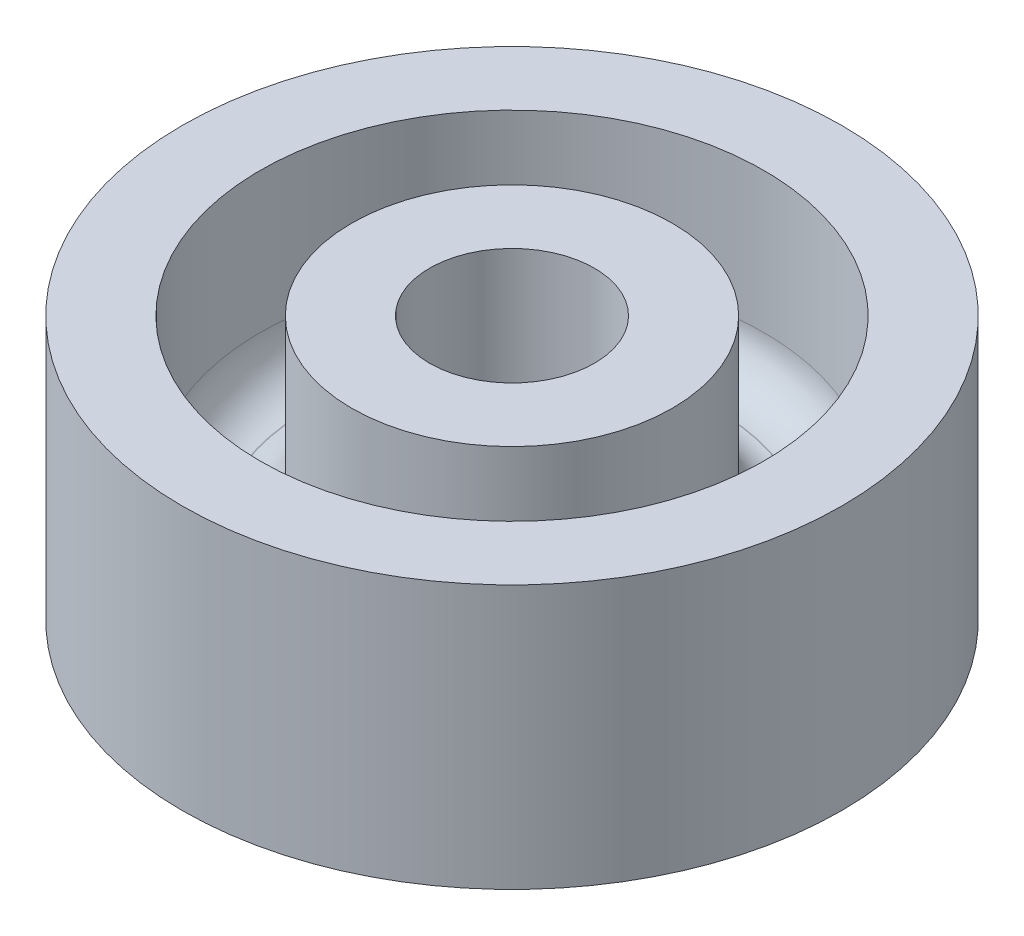
ISO-10303-21;
HEADER;
FILE_DESCRIPTION(('STEP AP214'),'2;1');
FILE_NAME('part.step','',(''),(''),'','','');
FILE_SCHEMA(('AUTOMOTIVE_DESIGN { 1 0 10303 214 1 1 1 1 }'));
ENDSEC;
DATA;
#1=APPLICATION_CONTEXT('core data for automotive mechanical design processes');
#2=APPLICATION_PROTOCOL_DEFINITION('international standard','automotive_design',2000,#1);
#3=PRODUCT_CONTEXT('',#1,'mechanical');
#4=PRODUCT('Part','Part','',(#3));
#5=PRODUCT_RELATED_PRODUCT_CATEGORY('part','',(#4));
#6=PRODUCT_DEFINITION_FORMATION('','',#4);
#7=PRODUCT_DEFINITION_CONTEXT('part definition',#1,'design');
#8=PRODUCT_DEFINITION('design','',#6,#7);
#9=PRODUCT_DEFINITION_SHAPE('','',#8);
#10=(LENGTH_UNIT() NAMED_UNIT(*) SI_UNIT(.MILLI.,.METRE.));
#11=(NAMED_UNIT(*) PLANE_ANGLE_UNIT() SI_UNIT($,.RADIAN.));
#12=(NAMED_UNIT(*) SI_UNIT($,.STERADIAN.) SOLID_ANGLE_UNIT());
#13=UNCERTAINTY_MEASURE_WITH_UNIT(LENGTH_MEASURE(1.E-05),#10,'distance_accuracy_value','');
#14=(GEOMETRIC_REPRESENTATION_CONTEXT(3) GLOBAL_UNCERTAINTY_ASSIGNED_CONTEXT((#13)) GLOBAL_UNIT_ASSIGNED_CONTEXT((#10,
#11,#12)) REPRESENTATION_CONTEXT('',''));
#15=CARTESIAN_POINT('',(0.,0.,0.));
#16=DIRECTION('',(0.,0.,1.));
#17=DIRECTION('',(1.,0.,0.));
#18=AXIS2_PLACEMENT_3D('',#15,#16,#17);
#19=CARTESIAN_POINT('',(0.,10.16,0.));
#20=DIRECTION('',(0.,-1.,0.));
#21=DIRECTION('',(0.,0.,-1.));
#22=AXIS2_PLACEMENT_3D('',#19,#20,#21);
#23=CYLINDRICAL_SURFACE('',#22,12.7);
#24=CARTESIAN_POINT('',(0.,10.16,0.));
#25=DIRECTION('',(0.,1.,0.));
#26=DIRECTION('',(0.,0.,1.));
#27=AXIS2_PLACEMENT_3D('',#24,#25,#26);
#28=CIRCLE('',#27,12.7);
#29=CARTESIAN_POINT('',(0.,10.16,12.7));
#30=VERTEX_POINT('',#29);
#31=EDGE_CURVE('E69',#30,#30,#28,.T.);
#32=ORIENTED_EDGE('',*,*,#31,.F.);
#33=EDGE_LOOP('',(#32));
#34=FACE_BOUND('',#33,.T.);
#35=CARTESIAN_POINT('',(0.,0.,0.));
#36=DIRECTION('',(0.,1.,0.));
#37=DIRECTION('',(0.,0.,1.));
#38=AXIS2_PLACEMENT_3D('',#35,#36,#37);
#39=CIRCLE('',#38,12.7);
#40=CARTESIAN_POINT('',(0.,0.,12.7));
#41=VERTEX_POINT('',#40);
#42=EDGE_CURVE('E70',#41,#41,#39,.T.);
#43=ORIENTED_EDGE('',*,*,#42,.T.);
#44=EDGE_LOOP('',(#43));
#45=FACE_BOUND('',#44,.T.);
#46=ADVANCED_FACE('F45',(#34,#45),#23,.T.);
#47=CARTESIAN_POINT('',(0.,10.16,0.));
#48=DIRECTION('',(0.,1.,0.));
#49=DIRECTION('',(0.,0.,1.));
#50=AXIS2_PLACEMENT_3D('',#47,#48,#49);
#51=PLANE('',#50);
#52=CARTESIAN_POINT('',(0.,10.16,0.));
#53=DIRECTION('',(0.,1.,0.));
#54=DIRECTION('',(0.,0.,1.));
#55=AXIS2_PLACEMENT_3D('',#52,#53,#54);
#56=CIRCLE('',#55,9.7);
#57=CARTESIAN_POINT('',(0.,10.16,9.7));
#58=VERTEX_POINT('',#57);
#59=EDGE_CURVE('E85',#58,#58,#56,.T.);
#60=ORIENTED_EDGE('',*,*,#59,.F.);
#61=EDGE_LOOP('',(#60));
#62=FACE_BOUND('',#61,.T.);
#63=ORIENTED_EDGE('',*,*,#31,.T.);
#64=EDGE_LOOP('',(#63));
#65=FACE_BOUND('',#64,.T.);
#66=ADVANCED_FACE('F96',(#62,#65),#51,.T.);
#67=CARTESIAN_POINT('',(0.,0.,0.));
#68=DIRECTION('',(0.,1.,0.));
#69=DIRECTION('',(0.,0.,1.));
#70=AXIS2_PLACEMENT_3D('',#67,#68,#69);
#71=PLANE('',#70);
#72=ORIENTED_EDGE('',*,*,#42,.F.);
#73=EDGE_LOOP('',(#72));
#74=FACE_BOUND('',#73,.T.);
#75=ADVANCED_FACE('F99',(#74),#71,.F.);
#76=CARTESIAN_POINT('',(0.,-27.435743110038,0.));
#77=DIRECTION('',(0.,1.,0.));
#78=DIRECTION('',(0.,0.,1.));
#79=AXIS2_PLACEMENT_3D('',#76,#77,#78);
#80=CYLINDRICAL_SURFACE('',#79,6.175);
#81=CARTESIAN_POINT('',(0.,4.75,0.));
#82=DIRECTION('',(0.,1.,0.));
#83=DIRECTION('',(0.,0.,1.));
#84=AXIS2_PLACEMENT_3D('',#81,#82,#83);
#85=CIRCLE('',#84,6.175);
#86=CARTESIAN_POINT('',(0.,4.75,6.175));
#87=VERTEX_POINT('',#86);
#88=EDGE_CURVE('E53',#87,#87,#85,.T.);
#89=ORIENTED_EDGE('',*,*,#88,.T.);
#90=EDGE_LOOP('',(#89));
#91=FACE_BOUND('',#90,.T.);
#92=CARTESIAN_POINT('',(0.,10.16,0.));
#93=DIRECTION('',(0.,1.,0.));
#94=DIRECTION('',(0.,0.,1.));
#95=AXIS2_PLACEMENT_3D('',#92,#93,#94);
#96=CIRCLE('',#95,6.175);
#97=CARTESIAN_POINT('',(0.,10.16,6.175));
#98=VERTEX_POINT('',#97);
#99=EDGE_CURVE('E86',#98,#98,#96,.T.);
#100=ORIENTED_EDGE('',*,*,#99,.F.);
#101=EDGE_LOOP('',(#100));
#102=FACE_BOUND('',#101,.T.);
#103=ADVANCED_FACE('F110',(#91,#102),#80,.T.);
#104=CARTESIAN_POINT('',(0.,-27.435743110038,0.));
#105=DIRECTION('',(0.,1.,0.));
#106=DIRECTION('',(0.,0.,1.));
#107=AXIS2_PLACEMENT_3D('',#104,#105,#106);
#108=CYLINDRICAL_SURFACE('',#107,9.7);
#109=CARTESIAN_POINT('',(0.,4.75,0.));
#110=DIRECTION('',(0.,1.,0.));
#111=DIRECTION('',(0.,0.,1.));
#112=AXIS2_PLACEMENT_3D('',#109,#110,#111);
#113=CIRCLE('',#112,9.7);
#114=CARTESIAN_POINT('',(0.,4.75,9.7));
#115=VERTEX_POINT('',#114);
#116=EDGE_CURVE('E12',#115,#115,#113,.F.);
#117=ORIENTED_EDGE('',*,*,#116,.T.);
#118=EDGE_LOOP('',(#117));
#119=FACE_BOUND('',#118,.T.);
#120=ORIENTED_EDGE('',*,*,#59,.T.);
#121=EDGE_LOOP('',(#120));
#122=FACE_BOUND('',#121,.T.);
#123=ADVANCED_FACE('F94',(#119,#122),#108,.F.);
#124=CARTESIAN_POINT('',(0.,3.,0.));
#125=DIRECTION('',(0.,1.,0.));
#126=DIRECTION('',(0.,0.,1.));
#127=AXIS2_PLACEMENT_3D('',#124,#125,#126);
#128=PLANE('',#127);
#129=CARTESIAN_POINT('',(0.,3.,0.));
#130=DIRECTION('',(0.,1.,0.));
#131=DIRECTION('',(0.,0.,1.));
#132=AXIS2_PLACEMENT_3D('',#129,#130,#131);
#133=CIRCLE('',#132,7.925);
#134=CARTESIAN_POINT('',(0.,3.,7.925));
#135=VERTEX_POINT('',#134);
#136=EDGE_CURVE('E58',#135,#135,#133,.F.);
#137=ORIENTED_EDGE('',*,*,#136,.T.);
#138=EDGE_LOOP('',(#137));
#139=FACE_BOUND('',#138,.T.);
#140=CARTESIAN_POINT('',(0.,3.,0.));
#141=DIRECTION('',(0.,1.,0.));
#142=DIRECTION('',(0.,0.,1.));
#143=AXIS2_PLACEMENT_3D('',#140,#141,#142);
#144=CIRCLE('',#143,7.95);
#145=CARTESIAN_POINT('',(0.,3.,7.95));
#146=VERTEX_POINT('',#145);
#147=EDGE_CURVE('E63',#146,#146,#144,.T.);
#148=ORIENTED_EDGE('',*,*,#147,.T.);
#149=EDGE_LOOP('',(#148));
#150=FACE_BOUND('',#149,.T.);
#151=ADVANCED_FACE('F132',(#139,#150),#128,.T.);
#152=CARTESIAN_POINT('',(0.,10.16,0.));
#153=DIRECTION('',(0.,1.,0.));
#154=DIRECTION('',(0.,0.,1.));
#155=AXIS2_PLACEMENT_3D('',#152,#153,#154);
#156=CIRCLE('',#155,3.175);
#157=CARTESIAN_POINT('',(0.,10.16,3.175));
#158=VERTEX_POINT('',#157);
#159=EDGE_CURVE('E81',#158,#158,#156,.T.);
#160=ORIENTED_EDGE('',*,*,#159,.F.);
#161=EDGE_LOOP('',(#160));
#162=FACE_BOUND('',#161,.T.);
#163=ORIENTED_EDGE('',*,*,#99,.T.);
#164=EDGE_LOOP('',(#163));
#165=FACE_BOUND('',#164,.T.);
#166=ADVANCED_FACE('F101',(#162,#165),#51,.T.);
#167=CARTESIAN_POINT('',(0.,-27.435743110038,0.));
#168=DIRECTION('',(0.,1.,0.));
#169=DIRECTION('',(0.,0.,1.));
#170=AXIS2_PLACEMENT_3D('',#167,#168,#169);
#171=CYLINDRICAL_SURFACE('',#170,3.175);
#172=CARTESIAN_POINT('',(0.,3.,0.));
#173=DIRECTION('',(0.,1.,0.));
#174=DIRECTION('',(0.,0.,1.));
#175=AXIS2_PLACEMENT_3D('',#172,#173,#174);
#176=CIRCLE('',#175,3.175);
#177=CARTESIAN_POINT('',(0.,3.,3.175));
#178=VERTEX_POINT('',#177);
#179=EDGE_CURVE('E74',#178,#178,#176,.F.);
#180=ORIENTED_EDGE('',*,*,#179,.T.);
#181=EDGE_LOOP('',(#180));
#182=FACE_BOUND('',#181,.T.);
#183=ORIENTED_EDGE('',*,*,#159,.T.);
#184=EDGE_LOOP('',(#183));
#185=FACE_BOUND('',#184,.T.);
#186=ADVANCED_FACE('F126',(#182,#185),#171,.F.);
#187=CARTESIAN_POINT('',(0.,3.,0.));
#188=DIRECTION('',(0.,1.,0.));
#189=DIRECTION('',(0.,0.,1.));
#190=AXIS2_PLACEMENT_3D('',#187,#188,#189);
#191=PLANE('',#190);
#192=ORIENTED_EDGE('',*,*,#179,.F.);
#193=EDGE_LOOP('',(#192));
#194=FACE_BOUND('',#193,.T.);
#195=ADVANCED_FACE('F119',(#194),#191,.T.);
#196=CARTESIAN_POINT('',(0.,4.75,0.));
#197=DIRECTION('',(0.,1.,0.));
#198=DIRECTION('',(0.,0.,1.));
#199=AXIS2_PLACEMENT_3D('',#196,#197,#198);
#200=TOROIDAL_SURFACE('',#199,7.925,1.75);
#201=ORIENTED_EDGE('',*,*,#88,.F.);
#202=EDGE_LOOP('',(#201));
#203=FACE_BOUND('',#202,.T.);
#204=ORIENTED_EDGE('',*,*,#136,.F.);
#205=EDGE_LOOP('',(#204));
#206=FACE_BOUND('',#205,.T.);
#207=ADVANCED_FACE('F117',(#203,#206),#200,.F.);
#208=CARTESIAN_POINT('',(0.,4.75,0.));
#209=DIRECTION('',(0.,1.,0.));
#210=DIRECTION('',(0.,0.,1.));
#211=AXIS2_PLACEMENT_3D('',#208,#209,#210);
#212=TOROIDAL_SURFACE('',#211,7.95,1.75);
#213=ORIENTED_EDGE('',*,*,#147,.F.);
#214=EDGE_LOOP('',(#213));
#215=FACE_BOUND('',#214,.T.);
#216=ORIENTED_EDGE('',*,*,#116,.F.);
#217=EDGE_LOOP('',(#216));
#218=FACE_BOUND('',#217,.T.);
#219=ADVANCED_FACE('F47',(#215,#218),#212,.F.);
#220=CLOSED_SHELL('',(#46,#66,#75,#103,#123,#151,#166,#186,#195,#207,#219));
#221=MANIFOLD_SOLID_BREP('B2',#220);
#222=ADVANCED_BREP_SHAPE_REPRESENTATION('',(#18,#221),#14);
#223=SHAPE_DEFINITION_REPRESENTATION(#9,#222);
ENDSEC;
END-ISO-10303-21;
